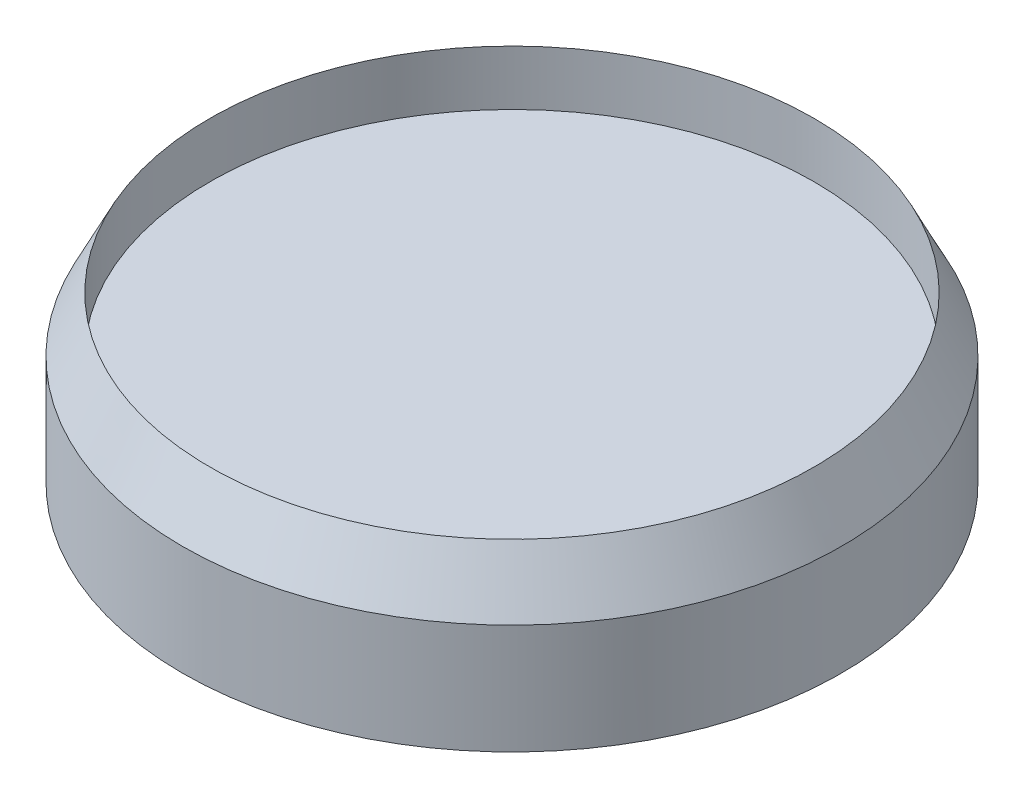
ISO-10303-21;
HEADER;
FILE_DESCRIPTION(('STEP AP214'),'2;1');
FILE_NAME('part.step','',(''),(''),'','','');
FILE_SCHEMA(('AUTOMOTIVE_DESIGN { 1 0 10303 214 1 1 1 1 }'));
ENDSEC;
DATA;
#1=APPLICATION_CONTEXT('core data for automotive mechanical design processes');
#2=APPLICATION_PROTOCOL_DEFINITION('international standard','automotive_design',2000,#1);
#3=PRODUCT_CONTEXT('',#1,'mechanical');
#4=PRODUCT('Part','Part','',(#3));
#5=PRODUCT_RELATED_PRODUCT_CATEGORY('part','',(#4));
#6=PRODUCT_DEFINITION_FORMATION('','',#4);
#7=PRODUCT_DEFINITION_CONTEXT('part definition',#1,'design');
#8=PRODUCT_DEFINITION('design','',#6,#7);
#9=PRODUCT_DEFINITION_SHAPE('','',#8);
#10=(LENGTH_UNIT() NAMED_UNIT(*) SI_UNIT(.MILLI.,.METRE.));
#11=(NAMED_UNIT(*) PLANE_ANGLE_UNIT() SI_UNIT($,.RADIAN.));
#12=(NAMED_UNIT(*) SI_UNIT($,.STERADIAN.) SOLID_ANGLE_UNIT());
#13=UNCERTAINTY_MEASURE_WITH_UNIT(LENGTH_MEASURE(1.E-05),#10,'distance_accuracy_value','');
#14=(GEOMETRIC_REPRESENTATION_CONTEXT(3) GLOBAL_UNCERTAINTY_ASSIGNED_CONTEXT((#13)) GLOBAL_UNIT_ASSIGNED_CONTEXT((#10,
#11,#12)) REPRESENTATION_CONTEXT('',''));
#15=CARTESIAN_POINT('',(0.,0.,0.));
#16=DIRECTION('',(0.,0.,1.));
#17=DIRECTION('',(1.,0.,0.));
#18=AXIS2_PLACEMENT_3D('',#15,#16,#17);
#19=CARTESIAN_POINT('',(0.,10.,0.));
#20=DIRECTION('',(0.,-1.,0.));
#21=DIRECTION('',(0.,0.,-1.));
#22=AXIS2_PLACEMENT_3D('',#19,#20,#21);
#23=CYLINDRICAL_SURFACE('',#22,30.);
#24=CARTESIAN_POINT('',(0.,10.,0.));
#25=DIRECTION('',(0.,1.,0.));
#26=DIRECTION('',(0.,0.,1.));
#27=AXIS2_PLACEMENT_3D('',#24,#25,#26);
#28=CIRCLE('',#27,30.);
#29=CARTESIAN_POINT('',(0.,10.,30.));
#30=VERTEX_POINT('',#29);
#31=EDGE_CURVE('E10',#30,#30,#28,.T.);
#32=ORIENTED_EDGE('',*,*,#31,.F.);
#33=EDGE_LOOP('',(#32));
#34=FACE_BOUND('',#33,.T.);
#35=CARTESIAN_POINT('',(0.,0.,0.));
#36=DIRECTION('',(0.,1.,0.));
#37=DIRECTION('',(0.,0.,1.));
#38=AXIS2_PLACEMENT_3D('',#35,#36,#37);
#39=CIRCLE('',#38,30.);
#40=CARTESIAN_POINT('',(0.,0.,30.));
#41=VERTEX_POINT('',#40);
#42=EDGE_CURVE('E37',#41,#41,#39,.T.);
#43=ORIENTED_EDGE('',*,*,#42,.T.);
#44=EDGE_LOOP('',(#43));
#45=FACE_BOUND('',#44,.T.);
#46=ADVANCED_FACE('F34',(#34,#45),#23,.T.);
#47=CARTESIAN_POINT('',(0.,0.,0.));
#48=DIRECTION('',(0.,1.,0.));
#49=DIRECTION('',(0.,0.,1.));
#50=AXIS2_PLACEMENT_3D('',#47,#48,#49);
#51=PLANE('',#50);
#52=ORIENTED_EDGE('',*,*,#42,.F.);
#53=EDGE_LOOP('',(#52));
#54=FACE_BOUND('',#53,.T.);
#55=ADVANCED_FACE('F57',(#54),#51,.F.);
#56=CARTESIAN_POINT('',(0.,10.,0.));
#57=DIRECTION('',(0.,-1.,0.));
#58=DIRECTION('',(0.,0.,-1.));
#59=AXIS2_PLACEMENT_3D('',#56,#57,#58);
#60=CYLINDRICAL_SURFACE('',#59,27.5);
#61=CARTESIAN_POINT('',(0.,15.,0.));
#62=DIRECTION('',(0.,-1.,0.));
#63=DIRECTION('',(0.,0.,-1.));
#64=AXIS2_PLACEMENT_3D('',#61,#62,#63);
#65=CIRCLE('',#64,27.5);
#66=CARTESIAN_POINT('',(0.,15.,-27.5));
#67=VERTEX_POINT('',#66);
#68=EDGE_CURVE('E48',#67,#67,#65,.T.);
#69=ORIENTED_EDGE('',*,*,#68,.F.);
#70=EDGE_LOOP('',(#69));
#71=FACE_BOUND('',#70,.T.);
#72=CARTESIAN_POINT('',(0.,10.,0.));
#73=DIRECTION('',(0.,-1.,0.));
#74=DIRECTION('',(0.,0.,-1.));
#75=AXIS2_PLACEMENT_3D('',#72,#73,#74);
#76=CIRCLE('',#75,27.5);
#77=CARTESIAN_POINT('',(0.,10.,-27.5));
#78=VERTEX_POINT('',#77);
#79=EDGE_CURVE('E44',#78,#78,#76,.T.);
#80=ORIENTED_EDGE('',*,*,#79,.T.);
#81=EDGE_LOOP('',(#80));
#82=FACE_BOUND('',#81,.T.);
#83=ADVANCED_FACE('F54',(#71,#82),#60,.F.);
#84=CARTESIAN_POINT('',(0.,15.,0.));
#85=DIRECTION('',(0.,-1.,0.));
#86=DIRECTION('',(0.,0.,-1.));
#87=AXIS2_PLACEMENT_3D('',#84,#85,#86);
#88=CONICAL_SURFACE('',#87,27.5,0.463647609000806);
#89=ORIENTED_EDGE('',*,*,#31,.T.);
#90=EDGE_LOOP('',(#89));
#91=FACE_BOUND('',#90,.T.);
#92=ORIENTED_EDGE('',*,*,#68,.T.);
#93=EDGE_LOOP('',(#92));
#94=FACE_BOUND('',#93,.T.);
#95=ADVANCED_FACE('F52',(#91,#94),#88,.T.);
#96=CARTESIAN_POINT('',(0.,10.,0.));
#97=DIRECTION('',(0.,1.,0.));
#98=DIRECTION('',(0.,0.,1.));
#99=AXIS2_PLACEMENT_3D('',#96,#97,#98);
#100=PLANE('',#99);
#101=ORIENTED_EDGE('',*,*,#79,.F.);
#102=EDGE_LOOP('',(#101));
#103=FACE_BOUND('',#102,.T.);
#104=ADVANCED_FACE('F61',(#103),#100,.T.);
#105=CLOSED_SHELL('',(#46,#55,#83,#95,#104));
#106=MANIFOLD_SOLID_BREP('B2',#105);
#107=ADVANCED_BREP_SHAPE_REPRESENTATION('',(#18,#106),#14);
#108=SHAPE_DEFINITION_REPRESENTATION(#9,#107);
ENDSEC;
END-ISO-10303-21;
